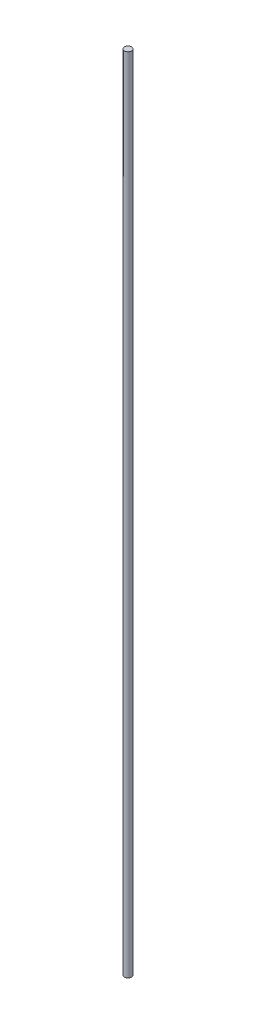
ISO-10303-21;
HEADER;
FILE_DESCRIPTION(('STEP AP214'),'2;1');
FILE_NAME('part.step','',(''),(''),'','','');
FILE_SCHEMA(('AUTOMOTIVE_DESIGN { 1 0 10303 214 1 1 1 1 }'));
ENDSEC;
DATA;
#1=APPLICATION_CONTEXT('core data for automotive mechanical design processes');
#2=APPLICATION_PROTOCOL_DEFINITION('international standard','automotive_design',2000,#1);
#3=PRODUCT_CONTEXT('',#1,'mechanical');
#4=PRODUCT('Part','Part','',(#3));
#5=PRODUCT_RELATED_PRODUCT_CATEGORY('part','',(#4));
#6=PRODUCT_DEFINITION_FORMATION('','',#4);
#7=PRODUCT_DEFINITION_CONTEXT('part definition',#1,'design');
#8=PRODUCT_DEFINITION('design','',#6,#7);
#9=PRODUCT_DEFINITION_SHAPE('','',#8);
#10=(LENGTH_UNIT() NAMED_UNIT(*) SI_UNIT(.MILLI.,.METRE.));
#11=(NAMED_UNIT(*) PLANE_ANGLE_UNIT() SI_UNIT($,.RADIAN.));
#12=(NAMED_UNIT(*) SI_UNIT($,.STERADIAN.) SOLID_ANGLE_UNIT());
#13=UNCERTAINTY_MEASURE_WITH_UNIT(LENGTH_MEASURE(1.E-05),#10,'distance_accuracy_value','');
#14=(GEOMETRIC_REPRESENTATION_CONTEXT(3) GLOBAL_UNCERTAINTY_ASSIGNED_CONTEXT((#13)) GLOBAL_UNIT_ASSIGNED_CONTEXT((#10,
#11,#12)) REPRESENTATION_CONTEXT('',''));
#15=CARTESIAN_POINT('',(0.,0.,0.));
#16=DIRECTION('',(0.,0.,1.));
#17=DIRECTION('',(1.,0.,0.));
#18=AXIS2_PLACEMENT_3D('',#15,#16,#17);
#19=CARTESIAN_POINT('',(0.,340.,0.));
#20=DIRECTION('',(0.,-1.,0.));
#21=DIRECTION('',(0.,0.,-1.));
#22=AXIS2_PLACEMENT_3D('',#19,#20,#21);
#23=CYLINDRICAL_SURFACE('',#22,1.5);
#24=CARTESIAN_POINT('',(0.,340.,0.));
#25=DIRECTION('',(0.,1.,0.));
#26=DIRECTION('',(0.,0.,1.));
#27=AXIS2_PLACEMENT_3D('',#24,#25,#26);
#28=CIRCLE('',#27,1.5);
#29=CARTESIAN_POINT('',(0.,340.,1.5));
#30=VERTEX_POINT('',#29);
#31=EDGE_CURVE('E10',#30,#30,#28,.T.);
#32=ORIENTED_EDGE('',*,*,#31,.F.);
#33=EDGE_LOOP('',(#32));
#34=FACE_BOUND('',#33,.T.);
#35=CARTESIAN_POINT('',(0.,0.,0.));
#36=DIRECTION('',(0.,1.,0.));
#37=DIRECTION('',(0.,0.,1.));
#38=AXIS2_PLACEMENT_3D('',#35,#36,#37);
#39=CIRCLE('',#38,1.5);
#40=CARTESIAN_POINT('',(0.,0.,1.5));
#41=VERTEX_POINT('',#40);
#42=EDGE_CURVE('E34',#41,#41,#39,.T.);
#43=ORIENTED_EDGE('',*,*,#42,.T.);
#44=EDGE_LOOP('',(#43));
#45=FACE_BOUND('',#44,.T.);
#46=ADVANCED_FACE('F31',(#34,#45),#23,.T.);
#47=CARTESIAN_POINT('',(0.,340.,0.));
#48=DIRECTION('',(0.,1.,0.));
#49=DIRECTION('',(0.,0.,1.));
#50=AXIS2_PLACEMENT_3D('',#47,#48,#49);
#51=PLANE('',#50);
#52=ORIENTED_EDGE('',*,*,#31,.T.);
#53=EDGE_LOOP('',(#52));
#54=FACE_BOUND('',#53,.T.);
#55=ADVANCED_FACE('F46',(#54),#51,.T.);
#56=CARTESIAN_POINT('',(0.,0.,0.));
#57=DIRECTION('',(0.,1.,0.));
#58=DIRECTION('',(0.,0.,1.));
#59=AXIS2_PLACEMENT_3D('',#56,#57,#58);
#60=PLANE('',#59);
#61=ORIENTED_EDGE('',*,*,#42,.F.);
#62=EDGE_LOOP('',(#61));
#63=FACE_BOUND('',#62,.T.);
#64=ADVANCED_FACE('F44',(#63),#60,.F.);
#65=CLOSED_SHELL('',(#46,#55,#64));
#66=MANIFOLD_SOLID_BREP('B2',#65);
#67=ADVANCED_BREP_SHAPE_REPRESENTATION('',(#18,#66),#14);
#68=SHAPE_DEFINITION_REPRESENTATION(#9,#67);
ENDSEC;
END-ISO-10303-21;
